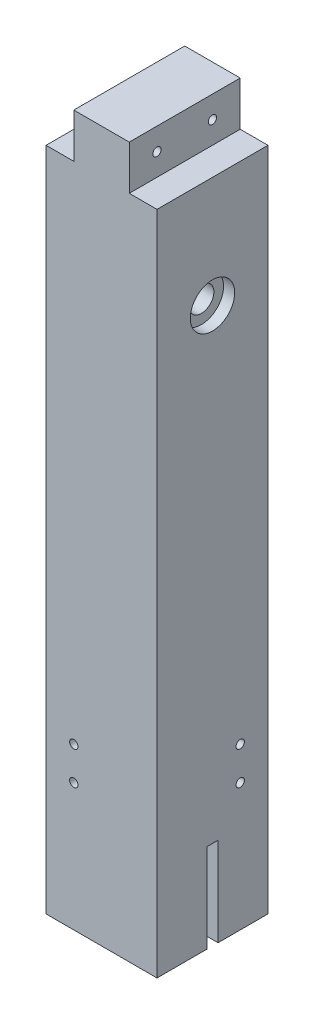
ISO-10303-21;
HEADER;
FILE_DESCRIPTION(('STEP AP214'),'2;1');
FILE_NAME('part.step','',(''),(''),'','','');
FILE_SCHEMA(('AUTOMOTIVE_DESIGN { 1 0 10303 214 1 1 1 1 }'));
ENDSEC;
DATA;
#1=APPLICATION_CONTEXT('core data for automotive mechanical design processes');
#2=APPLICATION_PROTOCOL_DEFINITION('international standard','automotive_design',2000,#1);
#3=PRODUCT_CONTEXT('',#1,'mechanical');
#4=PRODUCT('Part','Part','',(#3));
#5=PRODUCT_RELATED_PRODUCT_CATEGORY('part','',(#4));
#6=PRODUCT_DEFINITION_FORMATION('','',#4);
#7=PRODUCT_DEFINITION_CONTEXT('part definition',#1,'design');
#8=PRODUCT_DEFINITION('design','',#6,#7);
#9=PRODUCT_DEFINITION_SHAPE('','',#8);
#10=(LENGTH_UNIT() NAMED_UNIT(*) SI_UNIT(.MILLI.,.METRE.));
#11=(NAMED_UNIT(*) PLANE_ANGLE_UNIT() SI_UNIT($,.RADIAN.));
#12=(NAMED_UNIT(*) SI_UNIT($,.STERADIAN.) SOLID_ANGLE_UNIT());
#13=UNCERTAINTY_MEASURE_WITH_UNIT(LENGTH_MEASURE(1.E-05),#10,'distance_accuracy_value','');
#14=(GEOMETRIC_REPRESENTATION_CONTEXT(3) GLOBAL_UNCERTAINTY_ASSIGNED_CONTEXT((#13)) GLOBAL_UNIT_ASSIGNED_CONTEXT((#10,
#11,#12)) REPRESENTATION_CONTEXT('',''));
#15=CARTESIAN_POINT('',(0.,0.,0.));
#16=DIRECTION('',(0.,0.,1.));
#17=DIRECTION('',(1.,0.,0.));
#18=AXIS2_PLACEMENT_3D('',#15,#16,#17);
#19=CARTESIAN_POINT('',(-63.5000000000001,254.,63.5));
#20=DIRECTION('',(1.,0.,0.));
#21=DIRECTION('',(0.,1.,0.));
#22=AXIS2_PLACEMENT_3D('',#19,#20,#21);
#23=CYLINDRICAL_SURFACE('',#22,14.2875);
#24=CARTESIAN_POINT('',(-63.5000000000001,254.,63.5));
#25=DIRECTION('',(1.,0.,0.));
#26=DIRECTION('',(0.,1.,0.));
#27=AXIS2_PLACEMENT_3D('',#24,#25,#26);
#28=CIRCLE('',#27,14.2875);
#29=CARTESIAN_POINT('',(-63.5000000000001,268.2875,63.5));
#30=VERTEX_POINT('',#29);
#31=EDGE_CURVE('E272',#30,#30,#28,.T.);
#32=ORIENTED_EDGE('',*,*,#31,.F.);
#33=EDGE_LOOP('',(#32));
#34=FACE_BOUND('',#33,.T.);
#35=CARTESIAN_POINT('',(50.8000000000001,254.,63.5));
#36=DIRECTION('',(1.,0.,0.));
#37=DIRECTION('',(0.,1.,0.));
#38=AXIS2_PLACEMENT_3D('',#35,#36,#37);
#39=CIRCLE('',#38,14.2875);
#40=CARTESIAN_POINT('',(50.8000000000001,268.2875,63.5));
#41=VERTEX_POINT('',#40);
#42=EDGE_CURVE('E233',#41,#41,#39,.T.);
#43=ORIENTED_EDGE('',*,*,#42,.T.);
#44=EDGE_LOOP('',(#43));
#45=FACE_BOUND('',#44,.T.);
#46=ADVANCED_FACE('F33',(#34,#45),#23,.F.);
#47=CARTESIAN_POINT('',(-63.4999999999998,0.,127.));
#48=DIRECTION('',(1.,0.,0.));
#49=DIRECTION('',(0.,1.,0.));
#50=AXIS2_PLACEMENT_3D('',#47,#48,#49);
#51=PLANE('',#50);
#52=DIRECTION('',(0.,0.,1.));
#53=VECTOR('',#52,1.);
#54=CARTESIAN_POINT('',(-63.4999999999997,-254.,95.25));
#55=LINE('',#54,#53);
#56=CARTESIAN_POINT('',(-63.4999999999997,-254.,63.5));
#57=VERTEX_POINT('',#56);
#58=CARTESIAN_POINT('',(-63.4999999999997,-254.,95.25));
#59=VERTEX_POINT('',#58);
#60=EDGE_CURVE('E203',#57,#59,#55,.T.);
#61=ORIENTED_EDGE('',*,*,#60,.F.);
#62=DIRECTION('',(0.,-1.,0.));
#63=VECTOR('',#62,1.);
#64=CARTESIAN_POINT('',(-63.4999999999997,-177.8,63.5));
#65=LINE('',#64,#63);
#66=CARTESIAN_POINT('',(-63.4999999999997,-177.8,63.5));
#67=VERTEX_POINT('',#66);
#68=EDGE_CURVE('E50',#67,#57,#65,.T.);
#69=ORIENTED_EDGE('',*,*,#68,.F.);
#70=DIRECTION('',(0.,0.,-1.));
#71=VECTOR('',#70,1.);
#72=CARTESIAN_POINT('',(-63.4999999999997,-177.8,95.25));
#73=LINE('',#72,#71);
#74=CARTESIAN_POINT('',(-63.4999999999997,-177.8,95.25));
#75=VERTEX_POINT('',#74);
#76=EDGE_CURVE('E191',#75,#67,#73,.T.);
#77=ORIENTED_EDGE('',*,*,#76,.F.);
#78=DIRECTION('',(0.,1.,0.));
#79=VECTOR('',#78,1.);
#80=CARTESIAN_POINT('',(-63.4999999999997,-177.8,95.25));
#81=LINE('',#80,#79);
#82=EDGE_CURVE('E194',#59,#75,#81,.T.);
#83=ORIENTED_EDGE('',*,*,#82,.F.);
#84=EDGE_LOOP('',(#61,#69,#77,#83));
#85=FACE_BOUND('',#84,.T.);
#86=ORIENTED_EDGE('',*,*,#31,.T.);
#87=EDGE_LOOP('',(#86));
#88=FACE_BOUND('',#87,.T.);
#89=DIRECTION('',(0.,1.,0.));
#90=VECTOR('',#89,1.);
#91=CARTESIAN_POINT('',(-63.5000000000001,0.,69.85));
#92=LINE('',#91,#90);
#93=CARTESIAN_POINT('',(-63.5,-381.,69.85));
#94=VERTEX_POINT('',#93);
#95=CARTESIAN_POINT('',(-63.5,-279.4,69.85));
#96=VERTEX_POINT('',#95);
#97=EDGE_CURVE('E277',#94,#96,#92,.T.);
#98=ORIENTED_EDGE('',*,*,#97,.F.);
#99=DIRECTION('',(0.,0.,-1.));
#100=VECTOR('',#99,1.);
#101=CARTESIAN_POINT('',(-63.4999999999996,-381.,127.));
#102=LINE('',#101,#100);
#103=CARTESIAN_POINT('',(-63.4999999999996,-381.,127.));
#104=VERTEX_POINT('',#103);
#105=EDGE_CURVE('E353',#104,#94,#102,.T.);
#106=ORIENTED_EDGE('',*,*,#105,.F.);
#107=DIRECTION('',(0.,-1.,0.));
#108=VECTOR('',#107,1.);
#109=CARTESIAN_POINT('',(-63.4999999999998,0.,127.));
#110=LINE('',#109,#108);
#111=CARTESIAN_POINT('',(-63.5,381.,127.));
#112=VERTEX_POINT('',#111);
#113=EDGE_CURVE('E320',#112,#104,#110,.T.);
#114=ORIENTED_EDGE('',*,*,#113,.F.);
#115=DIRECTION('',(0.,0.,-1.));
#116=VECTOR('',#115,1.);
#117=CARTESIAN_POINT('',(-63.5,381.,127.));
#118=LINE('',#117,#116);
#119=CARTESIAN_POINT('',(-63.5,381.,0.));
#120=VERTEX_POINT('',#119);
#121=EDGE_CURVE('E356',#112,#120,#118,.T.);
#122=ORIENTED_EDGE('',*,*,#121,.T.);
#123=DIRECTION('',(0.,-1.,0.));
#124=VECTOR('',#123,1.);
#125=CARTESIAN_POINT('',(-63.4999999999998,0.,0.));
#126=LINE('',#125,#124);
#127=CARTESIAN_POINT('',(-63.4999999999996,-381.,0.));
#128=VERTEX_POINT('',#127);
#129=EDGE_CURVE('E339',#120,#128,#126,.T.);
#130=ORIENTED_EDGE('',*,*,#129,.T.);
#131=CARTESIAN_POINT('',(-63.5,-381.,57.15));
#132=VERTEX_POINT('',#131);
#133=EDGE_CURVE('E352',#132,#128,#102,.T.);
#134=ORIENTED_EDGE('',*,*,#133,.F.);
#135=DIRECTION('',(0.,1.,0.));
#136=VECTOR('',#135,1.);
#137=CARTESIAN_POINT('',(-63.5000000000001,0.,57.15));
#138=LINE('',#137,#136);
#139=CARTESIAN_POINT('',(-63.5,-279.4,57.15));
#140=VERTEX_POINT('',#139);
#141=EDGE_CURVE('E279',#132,#140,#138,.T.);
#142=ORIENTED_EDGE('',*,*,#141,.T.);
#143=DIRECTION('',(0.,0.,1.));
#144=VECTOR('',#143,1.);
#145=CARTESIAN_POINT('',(-63.5,-279.4,0.));
#146=LINE('',#145,#144);
#147=EDGE_CURVE('E283',#140,#96,#146,.T.);
#148=ORIENTED_EDGE('',*,*,#147,.T.);
#149=EDGE_LOOP('',(#98,#106,#114,#122,#130,#134,#142,#148));
#150=FACE_BOUND('',#149,.T.);
#151=ADVANCED_FACE('F417',(#85,#88,#150),#51,.F.);
#152=CARTESIAN_POINT('',(1.66533453693774E-13,-381.,127.));
#153=DIRECTION('',(0.,-1.,0.));
#154=DIRECTION('',(1.,0.,0.));
#155=AXIS2_PLACEMENT_3D('',#152,#153,#154);
#156=PLANE('',#155);
#157=ORIENTED_EDGE('',*,*,#105,.T.);
#158=DIRECTION('',(1.,0.,0.));
#159=VECTOR('',#158,1.);
#160=CARTESIAN_POINT('',(-63.5,-381.,69.85));
#161=LINE('',#160,#159);
#162=CARTESIAN_POINT('',(63.5000000000001,-381.,69.85));
#163=VERTEX_POINT('',#162);
#164=EDGE_CURVE('E286',#94,#163,#161,.T.);
#165=ORIENTED_EDGE('',*,*,#164,.T.);
#166=DIRECTION('',(0.,0.,-1.));
#167=VECTOR('',#166,1.);
#168=CARTESIAN_POINT('',(63.5000000000001,-381.,127.));
#169=LINE('',#168,#167);
#170=CARTESIAN_POINT('',(63.5000000000001,-381.,127.));
#171=VERTEX_POINT('',#170);
#172=EDGE_CURVE('E349',#171,#163,#169,.T.);
#173=ORIENTED_EDGE('',*,*,#172,.F.);
#174=DIRECTION('',(-1.,0.,0.));
#175=VECTOR('',#174,1.);
#176=CARTESIAN_POINT('',(1.66533453693774E-13,-381.,127.));
#177=LINE('',#176,#175);
#178=EDGE_CURVE('E322',#171,#104,#177,.T.);
#179=ORIENTED_EDGE('',*,*,#178,.T.);
#180=EDGE_LOOP('',(#157,#165,#173,#179));
#181=FACE_BOUND('',#180,.T.);
#182=ADVANCED_FACE('F423',(#181),#156,.T.);
#183=CARTESIAN_POINT('',(63.5000000000001,0.,127.));
#184=DIRECTION('',(1.,0.,0.));
#185=DIRECTION('',(0.,1.,0.));
#186=AXIS2_PLACEMENT_3D('',#183,#184,#185);
#187=PLANE('',#186);
#188=CARTESIAN_POINT('',(63.5000000000001,-196.85,31.75));
#189=DIRECTION('',(1.,0.,0.));
#190=DIRECTION('',(0.,1.,0.));
#191=AXIS2_PLACEMENT_3D('',#188,#189,#190);
#192=CIRCLE('',#191,4.7625);
#193=CARTESIAN_POINT('',(63.5000000000001,-192.0875,31.75));
#194=VERTEX_POINT('',#193);
#195=EDGE_CURVE('E209',#194,#194,#192,.T.);
#196=ORIENTED_EDGE('',*,*,#195,.F.);
#197=EDGE_LOOP('',(#196));
#198=FACE_BOUND('',#197,.T.);
#199=CARTESIAN_POINT('',(63.5000000000001,-234.95,31.75));
#200=DIRECTION('',(1.,0.,0.));
#201=DIRECTION('',(0.,1.,0.));
#202=AXIS2_PLACEMENT_3D('',#199,#200,#201);
#203=CIRCLE('',#202,4.7625);
#204=CARTESIAN_POINT('',(63.5000000000001,-230.1875,31.75));
#205=VERTEX_POINT('',#204);
#206=EDGE_CURVE('E222',#205,#205,#203,.T.);
#207=ORIENTED_EDGE('',*,*,#206,.F.);
#208=EDGE_LOOP('',(#207));
#209=FACE_BOUND('',#208,.T.);
#210=CARTESIAN_POINT('',(63.5000000000001,254.,63.5));
#211=DIRECTION('',(1.,0.,0.));
#212=DIRECTION('',(0.,1.,0.));
#213=AXIS2_PLACEMENT_3D('',#210,#211,#212);
#214=CIRCLE('',#213,25.4);
#215=CARTESIAN_POINT('',(63.5000000000001,279.4,63.5));
#216=VERTEX_POINT('',#215);
#217=EDGE_CURVE('E232',#216,#216,#214,.T.);
#218=ORIENTED_EDGE('',*,*,#217,.F.);
#219=EDGE_LOOP('',(#218));
#220=FACE_BOUND('',#219,.T.);
#221=ORIENTED_EDGE('',*,*,#172,.T.);
#222=DIRECTION('',(0.,1.,0.));
#223=VECTOR('',#222,1.);
#224=CARTESIAN_POINT('',(63.5000000000001,0.,69.85));
#225=LINE('',#224,#223);
#226=CARTESIAN_POINT('',(63.5000000000001,-279.4,69.85));
#227=VERTEX_POINT('',#226);
#228=EDGE_CURVE('E266',#163,#227,#225,.T.);
#229=ORIENTED_EDGE('',*,*,#228,.T.);
#230=DIRECTION('',(0.,0.,1.));
#231=VECTOR('',#230,1.);
#232=CARTESIAN_POINT('',(63.5000000000001,-279.4,0.));
#233=LINE('',#232,#231);
#234=CARTESIAN_POINT('',(63.5000000000001,-279.4,57.15));
#235=VERTEX_POINT('',#234);
#236=EDGE_CURVE('E280',#235,#227,#233,.T.);
#237=ORIENTED_EDGE('',*,*,#236,.F.);
#238=DIRECTION('',(0.,1.,0.));
#239=VECTOR('',#238,1.);
#240=CARTESIAN_POINT('',(63.5000000000001,0.,57.15));
#241=LINE('',#240,#239);
#242=CARTESIAN_POINT('',(63.5000000000001,-381.,57.15));
#243=VERTEX_POINT('',#242);
#244=EDGE_CURVE('E289',#243,#235,#241,.T.);
#245=ORIENTED_EDGE('',*,*,#244,.F.);
#246=CARTESIAN_POINT('',(63.5000000000001,-381.,0.));
#247=VERTEX_POINT('',#246);
#248=EDGE_CURVE('E348',#243,#247,#169,.T.);
#249=ORIENTED_EDGE('',*,*,#248,.T.);
#250=DIRECTION('',(0.,-1.,0.));
#251=VECTOR('',#250,1.);
#252=CARTESIAN_POINT('',(63.5000000000001,0.,0.));
#253=LINE('',#252,#251);
#254=CARTESIAN_POINT('',(63.5,381.,0.));
#255=VERTEX_POINT('',#254);
#256=EDGE_CURVE('E312',#255,#247,#253,.T.);
#257=ORIENTED_EDGE('',*,*,#256,.F.);
#258=DIRECTION('',(0.,0.,-1.));
#259=VECTOR('',#258,1.);
#260=CARTESIAN_POINT('',(63.5,381.,127.));
#261=LINE('',#260,#259);
#262=CARTESIAN_POINT('',(63.5,381.,127.));
#263=VERTEX_POINT('',#262);
#264=EDGE_CURVE('E328',#263,#255,#261,.T.);
#265=ORIENTED_EDGE('',*,*,#264,.F.);
#266=DIRECTION('',(0.,-1.,0.));
#267=VECTOR('',#266,1.);
#268=CARTESIAN_POINT('',(63.5000000000001,0.,127.));
#269=LINE('',#268,#267);
#270=EDGE_CURVE('E325',#263,#171,#269,.T.);
#271=ORIENTED_EDGE('',*,*,#270,.T.);
#272=EDGE_LOOP('',(#221,#229,#237,#245,#249,#257,#265,#271));
#273=FACE_BOUND('',#272,.T.);
#274=ADVANCED_FACE('F457',(#198,#209,#220,#273),#187,.T.);
#275=CARTESIAN_POINT('',(-1.66533453693773E-13,381.,127.));
#276=DIRECTION('',(0.,-1.,0.));
#277=DIRECTION('',(1.,0.,0.));
#278=AXIS2_PLACEMENT_3D('',#275,#276,#277);
#279=PLANE('',#278);
#280=DIRECTION('',(-1.,0.,0.));
#281=VECTOR('',#280,1.);
#282=CARTESIAN_POINT('',(-1.66533453693773E-13,381.,0.));
#283=LINE('',#282,#281);
#284=CARTESIAN_POINT('',(31.75,381.,0.));
#285=VERTEX_POINT('',#284);
#286=EDGE_CURVE('E308',#255,#285,#283,.T.);
#287=ORIENTED_EDGE('',*,*,#286,.T.);
#288=DIRECTION('',(0.,0.,-1.));
#289=VECTOR('',#288,1.);
#290=CARTESIAN_POINT('',(31.75,381.,127.));
#291=LINE('',#290,#289);
#292=CARTESIAN_POINT('',(31.75,381.,127.));
#293=VERTEX_POINT('',#292);
#294=EDGE_CURVE('E11',#293,#285,#291,.T.);
#295=ORIENTED_EDGE('',*,*,#294,.F.);
#296=DIRECTION('',(-1.,0.,0.));
#297=VECTOR('',#296,1.);
#298=CARTESIAN_POINT('',(-1.66533453693773E-13,381.,127.));
#299=LINE('',#298,#297);
#300=EDGE_CURVE('E309',#263,#293,#299,.T.);
#301=ORIENTED_EDGE('',*,*,#300,.F.);
#302=ORIENTED_EDGE('',*,*,#264,.T.);
#303=EDGE_LOOP('',(#287,#295,#301,#302));
#304=FACE_BOUND('',#303,.T.);
#305=ADVANCED_FACE('F460',(#304),#279,.F.);
#306=CARTESIAN_POINT('',(31.75,0.,127.));
#307=DIRECTION('',(1.,0.,0.));
#308=DIRECTION('',(0.,1.,0.));
#309=AXIS2_PLACEMENT_3D('',#306,#307,#308);
#310=PLANE('',#309);
#311=CARTESIAN_POINT('',(31.75,406.4,31.75));
#312=DIRECTION('',(1.,0.,0.));
#313=DIRECTION('',(0.,1.,0.));
#314=AXIS2_PLACEMENT_3D('',#311,#312,#313);
#315=CIRCLE('',#314,4.7625);
#316=CARTESIAN_POINT('',(31.75,411.1625,31.75));
#317=VERTEX_POINT('',#316);
#318=EDGE_CURVE('E301',#317,#317,#315,.T.);
#319=ORIENTED_EDGE('',*,*,#318,.F.);
#320=EDGE_LOOP('',(#319));
#321=FACE_BOUND('',#320,.T.);
#322=CARTESIAN_POINT('',(31.75,406.4,95.25));
#323=DIRECTION('',(1.,0.,0.));
#324=DIRECTION('',(0.,1.,0.));
#325=AXIS2_PLACEMENT_3D('',#322,#323,#324);
#326=CIRCLE('',#325,4.7625);
#327=CARTESIAN_POINT('',(31.75,411.1625,95.25));
#328=VERTEX_POINT('',#327);
#329=EDGE_CURVE('E305',#328,#328,#326,.T.);
#330=ORIENTED_EDGE('',*,*,#329,.F.);
#331=EDGE_LOOP('',(#330));
#332=FACE_BOUND('',#331,.T.);
#333=DIRECTION('',(0.,-1.,0.));
#334=VECTOR('',#333,1.);
#335=CARTESIAN_POINT('',(31.75,0.,0.));
#336=LINE('',#335,#334);
#337=CARTESIAN_POINT('',(31.75,431.8,0.));
#338=VERTEX_POINT('',#337);
#339=EDGE_CURVE('E331',#338,#285,#336,.T.);
#340=ORIENTED_EDGE('',*,*,#339,.F.);
#341=DIRECTION('',(0.,0.,-1.));
#342=VECTOR('',#341,1.);
#343=CARTESIAN_POINT('',(31.75,431.8,127.));
#344=LINE('',#343,#342);
#345=CARTESIAN_POINT('',(31.75,431.8,127.));
#346=VERTEX_POINT('',#345);
#347=EDGE_CURVE('E42',#346,#338,#344,.T.);
#348=ORIENTED_EDGE('',*,*,#347,.F.);
#349=DIRECTION('',(0.,-1.,0.));
#350=VECTOR('',#349,1.);
#351=CARTESIAN_POINT('',(31.75,0.,127.));
#352=LINE('',#351,#350);
#353=EDGE_CURVE('E311',#346,#293,#352,.T.);
#354=ORIENTED_EDGE('',*,*,#353,.T.);
#355=ORIENTED_EDGE('',*,*,#294,.T.);
#356=EDGE_LOOP('',(#340,#348,#354,#355));
#357=FACE_BOUND('',#356,.T.);
#358=ADVANCED_FACE('F35',(#321,#332,#357),#310,.T.);
#359=CARTESIAN_POINT('',(0.,431.8,127.));
#360=DIRECTION('',(0.,-1.,0.));
#361=DIRECTION('',(0.,0.,-1.));
#362=AXIS2_PLACEMENT_3D('',#359,#360,#361);
#363=PLANE('',#362);
#364=DIRECTION('',(-1.,0.,0.));
#365=VECTOR('',#364,1.);
#366=CARTESIAN_POINT('',(0.,431.8,0.));
#367=LINE('',#366,#365);
#368=CARTESIAN_POINT('',(-31.75,431.8,0.));
#369=VERTEX_POINT('',#368);
#370=EDGE_CURVE('E335',#338,#369,#367,.T.);
#371=ORIENTED_EDGE('',*,*,#370,.T.);
#372=DIRECTION('',(0.,0.,-1.));
#373=VECTOR('',#372,1.);
#374=CARTESIAN_POINT('',(-31.75,431.8,127.));
#375=LINE('',#374,#373);
#376=CARTESIAN_POINT('',(-31.75,431.8,127.));
#377=VERTEX_POINT('',#376);
#378=EDGE_CURVE('E362',#377,#369,#375,.T.);
#379=ORIENTED_EDGE('',*,*,#378,.F.);
#380=DIRECTION('',(-1.,0.,0.));
#381=VECTOR('',#380,1.);
#382=CARTESIAN_POINT('',(0.,431.8,127.));
#383=LINE('',#382,#381);
#384=EDGE_CURVE('E316',#346,#377,#383,.T.);
#385=ORIENTED_EDGE('',*,*,#384,.F.);
#386=ORIENTED_EDGE('',*,*,#347,.T.);
#387=EDGE_LOOP('',(#371,#379,#385,#386));
#388=FACE_BOUND('',#387,.T.);
#389=ADVANCED_FACE('F471',(#388),#363,.F.);
#390=CARTESIAN_POINT('',(-31.7499999999999,0.,127.));
#391=DIRECTION('',(1.,0.,0.));
#392=DIRECTION('',(0.,1.,0.));
#393=AXIS2_PLACEMENT_3D('',#390,#391,#392);
#394=PLANE('',#393);
#395=CARTESIAN_POINT('',(-31.75,406.4,31.75));
#396=DIRECTION('',(1.,0.,0.));
#397=DIRECTION('',(0.,1.,0.));
#398=AXIS2_PLACEMENT_3D('',#395,#396,#397);
#399=CIRCLE('',#398,4.7625);
#400=CARTESIAN_POINT('',(-31.75,411.1625,31.75));
#401=VERTEX_POINT('',#400);
#402=EDGE_CURVE('E275',#401,#401,#399,.T.);
#403=ORIENTED_EDGE('',*,*,#402,.T.);
#404=EDGE_LOOP('',(#403));
#405=FACE_BOUND('',#404,.T.);
#406=CARTESIAN_POINT('',(-31.75,406.4,95.25));
#407=DIRECTION('',(1.,0.,0.));
#408=DIRECTION('',(0.,1.,0.));
#409=AXIS2_PLACEMENT_3D('',#406,#407,#408);
#410=CIRCLE('',#409,4.7625);
#411=CARTESIAN_POINT('',(-31.75,411.1625,95.25));
#412=VERTEX_POINT('',#411);
#413=EDGE_CURVE('E304',#412,#412,#410,.T.);
#414=ORIENTED_EDGE('',*,*,#413,.T.);
#415=EDGE_LOOP('',(#414));
#416=FACE_BOUND('',#415,.T.);
#417=DIRECTION('',(0.,-1.,0.));
#418=VECTOR('',#417,1.);
#419=CARTESIAN_POINT('',(-31.7499999999999,0.,0.));
#420=LINE('',#419,#418);
#421=CARTESIAN_POINT('',(-31.75,381.,0.));
#422=VERTEX_POINT('',#421);
#423=EDGE_CURVE('E337',#369,#422,#420,.T.);
#424=ORIENTED_EDGE('',*,*,#423,.T.);
#425=DIRECTION('',(0.,0.,-1.));
#426=VECTOR('',#425,1.);
#427=CARTESIAN_POINT('',(-31.75,381.,127.));
#428=LINE('',#427,#426);
#429=CARTESIAN_POINT('',(-31.75,381.,127.));
#430=VERTEX_POINT('',#429);
#431=EDGE_CURVE('E359',#430,#422,#428,.T.);
#432=ORIENTED_EDGE('',*,*,#431,.F.);
#433=DIRECTION('',(0.,-1.,0.));
#434=VECTOR('',#433,1.);
#435=CARTESIAN_POINT('',(-31.7499999999999,0.,127.));
#436=LINE('',#435,#434);
#437=EDGE_CURVE('E318',#377,#430,#436,.T.);
#438=ORIENTED_EDGE('',*,*,#437,.F.);
#439=ORIENTED_EDGE('',*,*,#378,.T.);
#440=EDGE_LOOP('',(#424,#432,#438,#439));
#441=FACE_BOUND('',#440,.T.);
#442=ADVANCED_FACE('F468',(#405,#416,#441),#394,.F.);
#443=EDGE_CURVE('E332',#422,#120,#283,.T.);
#444=ORIENTED_EDGE('',*,*,#443,.T.);
#445=ORIENTED_EDGE('',*,*,#121,.F.);
#446=EDGE_CURVE('E313',#430,#112,#299,.T.);
#447=ORIENTED_EDGE('',*,*,#446,.F.);
#448=ORIENTED_EDGE('',*,*,#431,.T.);
#449=EDGE_LOOP('',(#444,#445,#447,#448));
#450=FACE_BOUND('',#449,.T.);
#451=ADVANCED_FACE('F463',(#450),#279,.F.);
#452=DIRECTION('',(1.,0.,0.));
#453=VECTOR('',#452,1.);
#454=CARTESIAN_POINT('',(-63.5,-381.,57.15));
#455=LINE('',#454,#453);
#456=EDGE_CURVE('E297',#132,#243,#455,.T.);
#457=ORIENTED_EDGE('',*,*,#456,.F.);
#458=ORIENTED_EDGE('',*,*,#133,.T.);
#459=DIRECTION('',(-1.,0.,0.));
#460=VECTOR('',#459,1.);
#461=CARTESIAN_POINT('',(1.66533453693774E-13,-381.,0.));
#462=LINE('',#461,#460);
#463=EDGE_CURVE('E342',#247,#128,#462,.T.);
#464=ORIENTED_EDGE('',*,*,#463,.F.);
#465=ORIENTED_EDGE('',*,*,#248,.F.);
#466=EDGE_LOOP('',(#457,#458,#464,#465));
#467=FACE_BOUND('',#466,.T.);
#468=ADVANCED_FACE('F452',(#467),#156,.T.);
#469=CARTESIAN_POINT('',(0.,0.,127.));
#470=DIRECTION('',(0.,0.,1.));
#471=DIRECTION('',(1.,0.,0.));
#472=AXIS2_PLACEMENT_3D('',#469,#470,#471);
#473=PLANE('',#472);
#474=CARTESIAN_POINT('',(-31.7499999999997,-196.85,127.));
#475=DIRECTION('',(0.,0.,1.));
#476=DIRECTION('',(1.,0.,0.));
#477=AXIS2_PLACEMENT_3D('',#474,#475,#476);
#478=CIRCLE('',#477,4.7625);
#479=CARTESIAN_POINT('',(-26.9874999999997,-196.85,127.));
#480=VERTEX_POINT('',#479);
#481=EDGE_CURVE('E389',#480,#480,#478,.T.);
#482=ORIENTED_EDGE('',*,*,#481,.F.);
#483=EDGE_LOOP('',(#482));
#484=FACE_BOUND('',#483,.T.);
#485=CARTESIAN_POINT('',(-31.7499999999997,-234.95,127.));
#486=DIRECTION('',(0.,0.,1.));
#487=DIRECTION('',(1.,0.,0.));
#488=AXIS2_PLACEMENT_3D('',#485,#486,#487);
#489=CIRCLE('',#488,4.7625);
#490=CARTESIAN_POINT('',(-26.9874999999997,-234.95,127.));
#491=VERTEX_POINT('',#490);
#492=EDGE_CURVE('E380',#491,#491,#489,.T.);
#493=ORIENTED_EDGE('',*,*,#492,.F.);
#494=EDGE_LOOP('',(#493));
#495=FACE_BOUND('',#494,.T.);
#496=ORIENTED_EDGE('',*,*,#300,.T.);
#497=ORIENTED_EDGE('',*,*,#353,.F.);
#498=ORIENTED_EDGE('',*,*,#384,.T.);
#499=ORIENTED_EDGE('',*,*,#437,.T.);
#500=ORIENTED_EDGE('',*,*,#446,.T.);
#501=ORIENTED_EDGE('',*,*,#113,.T.);
#502=ORIENTED_EDGE('',*,*,#178,.F.);
#503=ORIENTED_EDGE('',*,*,#270,.F.);
#504=EDGE_LOOP('',(#496,#497,#498,#499,#500,#501,#502,#503));
#505=FACE_BOUND('',#504,.T.);
#506=ADVANCED_FACE('F449',(#484,#495,#505),#473,.T.);
#507=CARTESIAN_POINT('',(0.,0.,0.));
#508=DIRECTION('',(0.,0.,1.));
#509=DIRECTION('',(1.,0.,0.));
#510=AXIS2_PLACEMENT_3D('',#507,#508,#509);
#511=PLANE('',#510);
#512=DIRECTION('',(-1.,0.,0.));
#513=VECTOR('',#512,1.);
#514=CARTESIAN_POINT('',(0.,-254.,0.));
#515=LINE('',#514,#513);
#516=CARTESIAN_POINT('',(31.75,-254.,0.));
#517=VERTEX_POINT('',#516);
#518=CARTESIAN_POINT('',(0.,-254.,0.));
#519=VERTEX_POINT('',#518);
#520=EDGE_CURVE('E256',#517,#519,#515,.T.);
#521=ORIENTED_EDGE('',*,*,#520,.F.);
#522=DIRECTION('',(0.,-1.,0.));
#523=VECTOR('',#522,1.);
#524=CARTESIAN_POINT('',(31.75,-177.8,0.));
#525=LINE('',#524,#523);
#526=CARTESIAN_POINT('',(31.75,-177.8,0.));
#527=VERTEX_POINT('',#526);
#528=EDGE_CURVE('E58',#527,#517,#525,.T.);
#529=ORIENTED_EDGE('',*,*,#528,.F.);
#530=DIRECTION('',(1.,0.,0.));
#531=VECTOR('',#530,1.);
#532=CARTESIAN_POINT('',(0.,-177.8,0.));
#533=LINE('',#532,#531);
#534=CARTESIAN_POINT('',(0.,-177.8,0.));
#535=VERTEX_POINT('',#534);
#536=EDGE_CURVE('E245',#535,#527,#533,.T.);
#537=ORIENTED_EDGE('',*,*,#536,.F.);
#538=DIRECTION('',(0.,1.,0.));
#539=VECTOR('',#538,1.);
#540=CARTESIAN_POINT('',(0.,-177.8,0.));
#541=LINE('',#540,#539);
#542=EDGE_CURVE('E259',#519,#535,#541,.T.);
#543=ORIENTED_EDGE('',*,*,#542,.F.);
#544=EDGE_LOOP('',(#521,#529,#537,#543));
#545=FACE_BOUND('',#544,.T.);
#546=ORIENTED_EDGE('',*,*,#286,.F.);
#547=ORIENTED_EDGE('',*,*,#256,.T.);
#548=ORIENTED_EDGE('',*,*,#463,.T.);
#549=ORIENTED_EDGE('',*,*,#129,.F.);
#550=ORIENTED_EDGE('',*,*,#443,.F.);
#551=ORIENTED_EDGE('',*,*,#423,.F.);
#552=ORIENTED_EDGE('',*,*,#370,.F.);
#553=ORIENTED_EDGE('',*,*,#339,.T.);
#554=EDGE_LOOP('',(#546,#547,#548,#549,#550,#551,#552,#553));
#555=FACE_BOUND('',#554,.T.);
#556=ADVANCED_FACE('F447',(#545,#555),#511,.F.);
#557=CARTESIAN_POINT('',(-63.5000000000001,406.4,95.25));
#558=DIRECTION('',(1.,0.,0.));
#559=DIRECTION('',(0.,1.,0.));
#560=AXIS2_PLACEMENT_3D('',#557,#558,#559);
#561=CYLINDRICAL_SURFACE('',#560,4.7625);
#562=ORIENTED_EDGE('',*,*,#329,.T.);
#563=EDGE_LOOP('',(#562));
#564=FACE_BOUND('',#563,.T.);
#565=ORIENTED_EDGE('',*,*,#413,.F.);
#566=EDGE_LOOP('',(#565));
#567=FACE_BOUND('',#566,.T.);
#568=ADVANCED_FACE('F443',(#564,#567),#561,.F.);
#569=CARTESIAN_POINT('',(-63.5000000000001,0.,69.85));
#570=DIRECTION('',(0.,0.,-1.));
#571=DIRECTION('',(-1.,0.,0.));
#572=AXIS2_PLACEMENT_3D('',#569,#570,#571);
#573=PLANE('',#572);
#574=ORIENTED_EDGE('',*,*,#228,.F.);
#575=ORIENTED_EDGE('',*,*,#164,.F.);
#576=ORIENTED_EDGE('',*,*,#97,.T.);
#577=DIRECTION('',(1.,0.,0.));
#578=VECTOR('',#577,1.);
#579=CARTESIAN_POINT('',(-63.5,-279.4,69.85));
#580=LINE('',#579,#578);
#581=EDGE_CURVE('E276',#96,#227,#580,.T.);
#582=ORIENTED_EDGE('',*,*,#581,.T.);
#583=EDGE_LOOP('',(#574,#575,#576,#582));
#584=FACE_BOUND('',#583,.T.);
#585=ADVANCED_FACE('F436',(#584),#573,.T.);
#586=CARTESIAN_POINT('',(-63.5,-279.4,0.));
#587=DIRECTION('',(0.,1.,0.));
#588=DIRECTION('',(-1.,0.,0.));
#589=AXIS2_PLACEMENT_3D('',#586,#587,#588);
#590=PLANE('',#589);
#591=ORIENTED_EDGE('',*,*,#236,.T.);
#592=ORIENTED_EDGE('',*,*,#581,.F.);
#593=ORIENTED_EDGE('',*,*,#147,.F.);
#594=DIRECTION('',(1.,0.,0.));
#595=VECTOR('',#594,1.);
#596=CARTESIAN_POINT('',(-63.5,-279.4,57.15));
#597=LINE('',#596,#595);
#598=EDGE_CURVE('E295',#140,#235,#597,.T.);
#599=ORIENTED_EDGE('',*,*,#598,.T.);
#600=EDGE_LOOP('',(#591,#592,#593,#599));
#601=FACE_BOUND('',#600,.T.);
#602=ADVANCED_FACE('F432',(#601),#590,.F.);
#603=CARTESIAN_POINT('',(-63.5000000000001,0.,57.15));
#604=DIRECTION('',(0.,0.,-1.));
#605=DIRECTION('',(-1.,0.,0.));
#606=AXIS2_PLACEMENT_3D('',#603,#604,#605);
#607=PLANE('',#606);
#608=ORIENTED_EDGE('',*,*,#244,.T.);
#609=ORIENTED_EDGE('',*,*,#598,.F.);
#610=ORIENTED_EDGE('',*,*,#141,.F.);
#611=ORIENTED_EDGE('',*,*,#456,.T.);
#612=EDGE_LOOP('',(#608,#609,#610,#611));
#613=FACE_BOUND('',#612,.T.);
#614=ADVANCED_FACE('F435',(#613),#607,.F.);
#615=CARTESIAN_POINT('',(-63.5000000000001,406.4,31.75));
#616=DIRECTION('',(1.,0.,0.));
#617=DIRECTION('',(0.,1.,0.));
#618=AXIS2_PLACEMENT_3D('',#615,#616,#617);
#619=CYLINDRICAL_SURFACE('',#618,4.7625);
#620=ORIENTED_EDGE('',*,*,#318,.T.);
#621=EDGE_LOOP('',(#620));
#622=FACE_BOUND('',#621,.T.);
#623=ORIENTED_EDGE('',*,*,#402,.F.);
#624=EDGE_LOOP('',(#623));
#625=FACE_BOUND('',#624,.T.);
#626=ADVANCED_FACE('F430',(#622,#625),#619,.F.);
#627=CARTESIAN_POINT('',(31.75,-177.8,63.5));
#628=DIRECTION('',(1.,0.,0.));
#629=DIRECTION('',(0.,1.,0.));
#630=AXIS2_PLACEMENT_3D('',#627,#628,#629);
#631=PLANE('',#630);
#632=CARTESIAN_POINT('',(31.75,-196.85,31.75));
#633=DIRECTION('',(1.,0.,0.));
#634=DIRECTION('',(0.,1.,0.));
#635=AXIS2_PLACEMENT_3D('',#632,#633,#634);
#636=CIRCLE('',#635,4.7625);
#637=CARTESIAN_POINT('',(31.75,-192.0875,31.75));
#638=VERTEX_POINT('',#637);
#639=EDGE_CURVE('E219',#638,#638,#636,.T.);
#640=ORIENTED_EDGE('',*,*,#639,.T.);
#641=EDGE_LOOP('',(#640));
#642=FACE_BOUND('',#641,.T.);
#643=CARTESIAN_POINT('',(31.75,-234.95,31.75));
#644=DIRECTION('',(1.,0.,0.));
#645=DIRECTION('',(0.,1.,0.));
#646=AXIS2_PLACEMENT_3D('',#643,#644,#645);
#647=CIRCLE('',#646,4.7625);
#648=CARTESIAN_POINT('',(31.75,-230.1875,31.75));
#649=VERTEX_POINT('',#648);
#650=EDGE_CURVE('E229',#649,#649,#647,.T.);
#651=ORIENTED_EDGE('',*,*,#650,.T.);
#652=EDGE_LOOP('',(#651));
#653=FACE_BOUND('',#652,.T.);
#654=ORIENTED_EDGE('',*,*,#528,.T.);
#655=DIRECTION('',(0.,0.,-1.));
#656=VECTOR('',#655,1.);
#657=CARTESIAN_POINT('',(31.75,-254.,63.5));
#658=LINE('',#657,#656);
#659=CARTESIAN_POINT('',(31.75,-254.,63.5));
#660=VERTEX_POINT('',#659);
#661=EDGE_CURVE('E254',#660,#517,#658,.T.);
#662=ORIENTED_EDGE('',*,*,#661,.F.);
#663=DIRECTION('',(0.,-1.,0.));
#664=VECTOR('',#663,1.);
#665=CARTESIAN_POINT('',(31.75,-177.8,63.5));
#666=LINE('',#665,#664);
#667=CARTESIAN_POINT('',(31.75,-177.8,63.5));
#668=VERTEX_POINT('',#667);
#669=EDGE_CURVE('E241',#668,#660,#666,.T.);
#670=ORIENTED_EDGE('',*,*,#669,.F.);
#671=DIRECTION('',(0.,0.,-1.));
#672=VECTOR('',#671,1.);
#673=CARTESIAN_POINT('',(31.75,-177.8,63.5));
#674=LINE('',#673,#672);
#675=EDGE_CURVE('E264',#668,#527,#674,.T.);
#676=ORIENTED_EDGE('',*,*,#675,.T.);
#677=EDGE_LOOP('',(#654,#662,#670,#676));
#678=FACE_BOUND('',#677,.T.);
#679=ADVANCED_FACE('F586',(#642,#653,#678),#631,.F.);
#680=CARTESIAN_POINT('',(0.,-177.8,63.5));
#681=DIRECTION('',(0.,1.,0.));
#682=DIRECTION('',(0.,0.,1.));
#683=AXIS2_PLACEMENT_3D('',#680,#681,#682);
#684=PLANE('',#683);
#685=ORIENTED_EDGE('',*,*,#536,.T.);
#686=ORIENTED_EDGE('',*,*,#675,.F.);
#687=DIRECTION('',(1.,0.,0.));
#688=VECTOR('',#687,1.);
#689=CARTESIAN_POINT('',(0.,-177.8,63.5));
#690=LINE('',#689,#688);
#691=CARTESIAN_POINT('',(0.,-177.8,63.5));
#692=VERTEX_POINT('',#691);
#693=EDGE_CURVE('E251',#692,#668,#690,.T.);
#694=ORIENTED_EDGE('',*,*,#693,.F.);
#695=DIRECTION('',(0.,0.,-1.));
#696=VECTOR('',#695,1.);
#697=CARTESIAN_POINT('',(0.,-177.8,63.5));
#698=LINE('',#697,#696);
#699=EDGE_CURVE('E267',#692,#535,#698,.T.);
#700=ORIENTED_EDGE('',*,*,#699,.T.);
#701=EDGE_LOOP('',(#685,#686,#694,#700));
#702=FACE_BOUND('',#701,.T.);
#703=ADVANCED_FACE('F600',(#702),#684,.F.);
#704=CARTESIAN_POINT('',(0.,-177.8,63.5));
#705=DIRECTION('',(-1.,0.,0.));
#706=DIRECTION('',(0.,-1.,0.));
#707=AXIS2_PLACEMENT_3D('',#704,#705,#706);
#708=PLANE('',#707);
#709=CARTESIAN_POINT('',(0.,-196.85,31.75));
#710=DIRECTION('',(-1.,0.,0.));
#711=DIRECTION('',(0.,-1.,0.));
#712=AXIS2_PLACEMENT_3D('',#709,#710,#711);
#713=CIRCLE('',#712,4.7625);
#714=CARTESIAN_POINT('',(0.,-201.6125,31.75));
#715=VERTEX_POINT('',#714);
#716=EDGE_CURVE('E216',#715,#715,#713,.T.);
#717=ORIENTED_EDGE('',*,*,#716,.T.);
#718=EDGE_LOOP('',(#717));
#719=FACE_BOUND('',#718,.T.);
#720=CARTESIAN_POINT('',(0.,-234.95,31.75));
#721=DIRECTION('',(-1.,0.,0.));
#722=DIRECTION('',(0.,-1.,0.));
#723=AXIS2_PLACEMENT_3D('',#720,#721,#722);
#724=CIRCLE('',#723,4.7625);
#725=CARTESIAN_POINT('',(0.,-239.7125,31.75));
#726=VERTEX_POINT('',#725);
#727=EDGE_CURVE('E226',#726,#726,#724,.T.);
#728=ORIENTED_EDGE('',*,*,#727,.T.);
#729=EDGE_LOOP('',(#728));
#730=FACE_BOUND('',#729,.T.);
#731=ORIENTED_EDGE('',*,*,#542,.T.);
#732=ORIENTED_EDGE('',*,*,#699,.F.);
#733=DIRECTION('',(0.,1.,0.));
#734=VECTOR('',#733,1.);
#735=CARTESIAN_POINT('',(0.,-177.8,63.5));
#736=LINE('',#735,#734);
#737=CARTESIAN_POINT('',(0.,-254.,63.5));
#738=VERTEX_POINT('',#737);
#739=EDGE_CURVE('E248',#738,#692,#736,.T.);
#740=ORIENTED_EDGE('',*,*,#739,.F.);
#741=DIRECTION('',(0.,0.,-1.));
#742=VECTOR('',#741,1.);
#743=CARTESIAN_POINT('',(0.,-254.,63.5));
#744=LINE('',#743,#742);
#745=EDGE_CURVE('E269',#738,#519,#744,.T.);
#746=ORIENTED_EDGE('',*,*,#745,.T.);
#747=EDGE_LOOP('',(#731,#732,#740,#746));
#748=FACE_BOUND('',#747,.T.);
#749=ADVANCED_FACE('F605',(#719,#730,#748),#708,.F.);
#750=CARTESIAN_POINT('',(0.,-254.,63.5));
#751=DIRECTION('',(0.,-1.,0.));
#752=DIRECTION('',(1.,0.,0.));
#753=AXIS2_PLACEMENT_3D('',#750,#751,#752);
#754=PLANE('',#753);
#755=ORIENTED_EDGE('',*,*,#520,.T.);
#756=ORIENTED_EDGE('',*,*,#745,.F.);
#757=DIRECTION('',(-1.,0.,0.));
#758=VECTOR('',#757,1.);
#759=CARTESIAN_POINT('',(0.,-254.,63.5));
#760=LINE('',#759,#758);
#761=EDGE_CURVE('E244',#660,#738,#760,.T.);
#762=ORIENTED_EDGE('',*,*,#761,.F.);
#763=ORIENTED_EDGE('',*,*,#661,.T.);
#764=EDGE_LOOP('',(#755,#756,#762,#763));
#765=FACE_BOUND('',#764,.T.);
#766=ADVANCED_FACE('F613',(#765),#754,.F.);
#767=CARTESIAN_POINT('',(0.,0.,63.5));
#768=DIRECTION('',(0.,0.,1.));
#769=DIRECTION('',(1.,0.,0.));
#770=AXIS2_PLACEMENT_3D('',#767,#768,#769);
#771=PLANE('',#770);
#772=ORIENTED_EDGE('',*,*,#669,.T.);
#773=ORIENTED_EDGE('',*,*,#761,.T.);
#774=ORIENTED_EDGE('',*,*,#739,.T.);
#775=ORIENTED_EDGE('',*,*,#693,.T.);
#776=EDGE_LOOP('',(#772,#773,#774,#775));
#777=FACE_BOUND('',#776,.T.);
#778=ADVANCED_FACE('F618',(#777),#771,.F.);
#779=CARTESIAN_POINT('',(50.8000000000001,254.,63.5));
#780=DIRECTION('',(1.,0.,0.));
#781=DIRECTION('',(0.,1.,0.));
#782=AXIS2_PLACEMENT_3D('',#779,#780,#781);
#783=CYLINDRICAL_SURFACE('',#782,25.4);
#784=CARTESIAN_POINT('',(50.8000000000001,254.,63.5));
#785=DIRECTION('',(1.,0.,0.));
#786=DIRECTION('',(0.,1.,0.));
#787=AXIS2_PLACEMENT_3D('',#784,#785,#786);
#788=CIRCLE('',#787,25.4);
#789=CARTESIAN_POINT('',(50.8000000000001,279.4,63.5));
#790=VERTEX_POINT('',#789);
#791=EDGE_CURVE('E236',#790,#790,#788,.T.);
#792=ORIENTED_EDGE('',*,*,#791,.F.);
#793=EDGE_LOOP('',(#792));
#794=FACE_BOUND('',#793,.T.);
#795=ORIENTED_EDGE('',*,*,#217,.T.);
#796=EDGE_LOOP('',(#795));
#797=FACE_BOUND('',#796,.T.);
#798=ADVANCED_FACE('F627',(#794,#797),#783,.F.);
#799=CARTESIAN_POINT('',(50.8000000000001,0.,0.));
#800=DIRECTION('',(1.,0.,0.));
#801=DIRECTION('',(0.,1.,0.));
#802=AXIS2_PLACEMENT_3D('',#799,#800,#801);
#803=PLANE('',#802);
#804=ORIENTED_EDGE('',*,*,#42,.F.);
#805=EDGE_LOOP('',(#804));
#806=FACE_BOUND('',#805,.T.);
#807=ORIENTED_EDGE('',*,*,#791,.T.);
#808=EDGE_LOOP('',(#807));
#809=FACE_BOUND('',#808,.T.);
#810=ADVANCED_FACE('F641',(#806,#809),#803,.T.);
#811=CARTESIAN_POINT('',(-6.34999999999993,0.,0.));
#812=DIRECTION('',(1.,0.,0.));
#813=DIRECTION('',(0.,1.,0.));
#814=AXIS2_PLACEMENT_3D('',#811,#812,#813);
#815=PLANE('',#814);
#816=CARTESIAN_POINT('',(-6.34999999999991,-234.95,31.75));
#817=DIRECTION('',(1.,0.,0.));
#818=DIRECTION('',(0.,1.,0.));
#819=AXIS2_PLACEMENT_3D('',#816,#817,#818);
#820=CIRCLE('',#819,4.7625);
#821=CARTESIAN_POINT('',(-6.34999999999991,-230.1875,31.75));
#822=VERTEX_POINT('',#821);
#823=EDGE_CURVE('E223',#822,#822,#820,.T.);
#824=ORIENTED_EDGE('',*,*,#823,.T.);
#825=EDGE_LOOP('',(#824));
#826=FACE_BOUND('',#825,.T.);
#827=ADVANCED_FACE('F650',(#826),#815,.T.);
#828=CARTESIAN_POINT('',(-6.34999999999991,-234.95,31.75));
#829=DIRECTION('',(1.,0.,0.));
#830=DIRECTION('',(0.,1.,0.));
#831=AXIS2_PLACEMENT_3D('',#828,#829,#830);
#832=CYLINDRICAL_SURFACE('',#831,4.7625);
#833=ORIENTED_EDGE('',*,*,#823,.F.);
#834=EDGE_LOOP('',(#833));
#835=FACE_BOUND('',#834,.T.);
#836=ORIENTED_EDGE('',*,*,#727,.F.);
#837=EDGE_LOOP('',(#836));
#838=FACE_BOUND('',#837,.T.);
#839=ADVANCED_FACE('F661',(#835,#838),#832,.F.);
#840=ORIENTED_EDGE('',*,*,#206,.T.);
#841=EDGE_LOOP('',(#840));
#842=FACE_BOUND('',#841,.T.);
#843=ORIENTED_EDGE('',*,*,#650,.F.);
#844=EDGE_LOOP('',(#843));
#845=FACE_BOUND('',#844,.T.);
#846=ADVANCED_FACE('F670',(#842,#845),#832,.F.);
#847=CARTESIAN_POINT('',(-6.34999999999993,0.,0.));
#848=DIRECTION('',(1.,0.,0.));
#849=DIRECTION('',(0.,1.,0.));
#850=AXIS2_PLACEMENT_3D('',#847,#848,#849);
#851=PLANE('',#850);
#852=CARTESIAN_POINT('',(-6.34999999999991,-196.85,31.75));
#853=DIRECTION('',(1.,0.,0.));
#854=DIRECTION('',(0.,1.,0.));
#855=AXIS2_PLACEMENT_3D('',#852,#853,#854);
#856=CIRCLE('',#855,4.7625);
#857=CARTESIAN_POINT('',(-6.34999999999991,-192.0875,31.75));
#858=VERTEX_POINT('',#857);
#859=EDGE_CURVE('E213',#858,#858,#856,.T.);
#860=ORIENTED_EDGE('',*,*,#859,.T.);
#861=EDGE_LOOP('',(#860));
#862=FACE_BOUND('',#861,.T.);
#863=ADVANCED_FACE('F678',(#862),#851,.T.);
#864=CARTESIAN_POINT('',(-6.34999999999991,-196.85,31.75));
#865=DIRECTION('',(1.,0.,0.));
#866=DIRECTION('',(0.,1.,0.));
#867=AXIS2_PLACEMENT_3D('',#864,#865,#866);
#868=CYLINDRICAL_SURFACE('',#867,4.7625);
#869=ORIENTED_EDGE('',*,*,#859,.F.);
#870=EDGE_LOOP('',(#869));
#871=FACE_BOUND('',#870,.T.);
#872=ORIENTED_EDGE('',*,*,#716,.F.);
#873=EDGE_LOOP('',(#872));
#874=FACE_BOUND('',#873,.T.);
#875=ADVANCED_FACE('F685',(#871,#874),#868,.F.);
#876=ORIENTED_EDGE('',*,*,#195,.T.);
#877=EDGE_LOOP('',(#876));
#878=FACE_BOUND('',#877,.T.);
#879=ORIENTED_EDGE('',*,*,#639,.F.);
#880=EDGE_LOOP('',(#879));
#881=FACE_BOUND('',#880,.T.);
#882=ADVANCED_FACE('F693',(#878,#881),#868,.F.);
#883=CARTESIAN_POINT('',(-0.253999999999727,-177.8,63.5));
#884=DIRECTION('',(0.,0.,-1.));
#885=DIRECTION('',(0.,1.,0.));
#886=AXIS2_PLACEMENT_3D('',#883,#884,#885);
#887=PLANE('',#886);
#888=CARTESIAN_POINT('',(-31.7499999999997,-196.85,63.5));
#889=DIRECTION('',(0.,0.,-1.));
#890=DIRECTION('',(0.,1.,0.));
#891=AXIS2_PLACEMENT_3D('',#888,#889,#890);
#892=CIRCLE('',#891,4.7625);
#893=CARTESIAN_POINT('',(-31.7499999999997,-192.0875,63.5));
#894=VERTEX_POINT('',#893);
#895=EDGE_CURVE('E385',#894,#894,#892,.T.);
#896=ORIENTED_EDGE('',*,*,#895,.T.);
#897=EDGE_LOOP('',(#896));
#898=FACE_BOUND('',#897,.T.);
#899=CARTESIAN_POINT('',(-31.7499999999997,-234.95,63.5));
#900=DIRECTION('',(0.,0.,-1.));
#901=DIRECTION('',(0.,1.,0.));
#902=AXIS2_PLACEMENT_3D('',#899,#900,#901);
#903=CIRCLE('',#902,4.7625);
#904=CARTESIAN_POINT('',(-31.7499999999997,-230.1875,63.5));
#905=VERTEX_POINT('',#904);
#906=EDGE_CURVE('E197',#905,#905,#903,.T.);
#907=ORIENTED_EDGE('',*,*,#906,.T.);
#908=EDGE_LOOP('',(#907));
#909=FACE_BOUND('',#908,.T.);
#910=ORIENTED_EDGE('',*,*,#68,.T.);
#911=DIRECTION('',(-1.,0.,0.));
#912=VECTOR('',#911,1.);
#913=CARTESIAN_POINT('',(-0.253999999999685,-254.,63.5));
#914=LINE('',#913,#912);
#915=CARTESIAN_POINT('',(-0.253999999999685,-254.,63.5));
#916=VERTEX_POINT('',#915);
#917=EDGE_CURVE('E169',#916,#57,#914,.T.);
#918=ORIENTED_EDGE('',*,*,#917,.F.);
#919=DIRECTION('',(0.,-1.,0.));
#920=VECTOR('',#919,1.);
#921=CARTESIAN_POINT('',(-0.253999999999727,-177.8,63.5));
#922=LINE('',#921,#920);
#923=CARTESIAN_POINT('',(-0.253999999999727,-177.8,63.5));
#924=VERTEX_POINT('',#923);
#925=EDGE_CURVE('E173',#924,#916,#922,.T.);
#926=ORIENTED_EDGE('',*,*,#925,.F.);
#927=DIRECTION('',(-1.,0.,0.));
#928=VECTOR('',#927,1.);
#929=CARTESIAN_POINT('',(-0.253999999999727,-177.8,63.5));
#930=LINE('',#929,#928);
#931=EDGE_CURVE('E207',#924,#67,#930,.T.);
#932=ORIENTED_EDGE('',*,*,#931,.T.);
#933=EDGE_LOOP('',(#910,#918,#926,#932));
#934=FACE_BOUND('',#933,.T.);
#935=ADVANCED_FACE('F171',(#898,#909,#934),#887,.F.);
#936=CARTESIAN_POINT('',(-0.253999999999727,-177.8,95.25));
#937=DIRECTION('',(0.,1.,0.));
#938=DIRECTION('',(-1.,0.,0.));
#939=AXIS2_PLACEMENT_3D('',#936,#937,#938);
#940=PLANE('',#939);
#941=ORIENTED_EDGE('',*,*,#76,.T.);
#942=ORIENTED_EDGE('',*,*,#931,.F.);
#943=DIRECTION('',(0.,0.,-1.));
#944=VECTOR('',#943,1.);
#945=CARTESIAN_POINT('',(-0.253999999999727,-177.8,95.25));
#946=LINE('',#945,#944);
#947=CARTESIAN_POINT('',(-0.253999999999727,-177.8,95.25));
#948=VERTEX_POINT('',#947);
#949=EDGE_CURVE('E179',#948,#924,#946,.T.);
#950=ORIENTED_EDGE('',*,*,#949,.F.);
#951=DIRECTION('',(-1.,0.,0.));
#952=VECTOR('',#951,1.);
#953=CARTESIAN_POINT('',(-0.253999999999727,-177.8,95.25));
#954=LINE('',#953,#952);
#955=EDGE_CURVE('E210',#948,#75,#954,.T.);
#956=ORIENTED_EDGE('',*,*,#955,.T.);
#957=EDGE_LOOP('',(#941,#942,#950,#956));
#958=FACE_BOUND('',#957,.T.);
#959=ADVANCED_FACE('F707',(#958),#940,.F.);
#960=CARTESIAN_POINT('',(-0.253999999999727,-177.8,95.25));
#961=DIRECTION('',(0.,0.,1.));
#962=DIRECTION('',(0.,-1.,0.));
#963=AXIS2_PLACEMENT_3D('',#960,#961,#962);
#964=PLANE('',#963);
#965=CARTESIAN_POINT('',(-31.7499999999997,-196.85,95.25));
#966=DIRECTION('',(0.,0.,1.));
#967=DIRECTION('',(0.,-1.,0.));
#968=AXIS2_PLACEMENT_3D('',#965,#966,#967);
#969=CIRCLE('',#968,4.7625);
#970=CARTESIAN_POINT('',(-31.7499999999997,-201.6125,95.25));
#971=VERTEX_POINT('',#970);
#972=EDGE_CURVE('E37',#971,#971,#969,.T.);
#973=ORIENTED_EDGE('',*,*,#972,.T.);
#974=EDGE_LOOP('',(#973));
#975=FACE_BOUND('',#974,.T.);
#976=CARTESIAN_POINT('',(-31.7499999999997,-234.95,95.25));
#977=DIRECTION('',(0.,0.,1.));
#978=DIRECTION('',(0.,-1.,0.));
#979=AXIS2_PLACEMENT_3D('',#976,#977,#978);
#980=CIRCLE('',#979,4.7625);
#981=CARTESIAN_POINT('',(-31.7499999999997,-239.7125,95.25));
#982=VERTEX_POINT('',#981);
#983=EDGE_CURVE('E373',#982,#982,#980,.T.);
#984=ORIENTED_EDGE('',*,*,#983,.T.);
#985=EDGE_LOOP('',(#984));
#986=FACE_BOUND('',#985,.T.);
#987=ORIENTED_EDGE('',*,*,#82,.T.);
#988=ORIENTED_EDGE('',*,*,#955,.F.);
#989=DIRECTION('',(0.,1.,0.));
#990=VECTOR('',#989,1.);
#991=CARTESIAN_POINT('',(-0.253999999999727,-177.8,95.25));
#992=LINE('',#991,#990);
#993=CARTESIAN_POINT('',(-0.253999999999685,-254.,95.25));
#994=VERTEX_POINT('',#993);
#995=EDGE_CURVE('E187',#994,#948,#992,.T.);
#996=ORIENTED_EDGE('',*,*,#995,.F.);
#997=DIRECTION('',(-1.,0.,0.));
#998=VECTOR('',#997,1.);
#999=CARTESIAN_POINT('',(-0.253999999999685,-254.,95.25));
#1000=LINE('',#999,#998);
#1001=EDGE_CURVE('E178',#994,#59,#1000,.T.);
#1002=ORIENTED_EDGE('',*,*,#1001,.T.);
#1003=EDGE_LOOP('',(#987,#988,#996,#1002));
#1004=FACE_BOUND('',#1003,.T.);
#1005=ADVANCED_FACE('F399',(#975,#986,#1004),#964,.F.);
#1006=CARTESIAN_POINT('',(-0.253999999999685,-254.,95.25));
#1007=DIRECTION('',(0.,-1.,0.));
#1008=DIRECTION('',(1.,0.,0.));
#1009=AXIS2_PLACEMENT_3D('',#1006,#1007,#1008);
#1010=PLANE('',#1009);
#1011=ORIENTED_EDGE('',*,*,#60,.T.);
#1012=ORIENTED_EDGE('',*,*,#1001,.F.);
#1013=DIRECTION('',(0.,0.,1.));
#1014=VECTOR('',#1013,1.);
#1015=CARTESIAN_POINT('',(-0.253999999999685,-254.,95.25));
#1016=LINE('',#1015,#1014);
#1017=EDGE_CURVE('E182',#916,#994,#1016,.T.);
#1018=ORIENTED_EDGE('',*,*,#1017,.F.);
#1019=ORIENTED_EDGE('',*,*,#917,.T.);
#1020=EDGE_LOOP('',(#1011,#1012,#1018,#1019));
#1021=FACE_BOUND('',#1020,.T.);
#1022=ADVANCED_FACE('F183',(#1021),#1010,.F.);
#1023=CARTESIAN_POINT('',(-0.253999999999824,0.,0.));
#1024=DIRECTION('',(1.,0.,0.));
#1025=DIRECTION('',(0.,1.,0.));
#1026=AXIS2_PLACEMENT_3D('',#1023,#1024,#1025);
#1027=PLANE('',#1026);
#1028=ORIENTED_EDGE('',*,*,#925,.T.);
#1029=ORIENTED_EDGE('',*,*,#1017,.T.);
#1030=ORIENTED_EDGE('',*,*,#995,.T.);
#1031=ORIENTED_EDGE('',*,*,#949,.T.);
#1032=EDGE_LOOP('',(#1028,#1029,#1030,#1031));
#1033=FACE_BOUND('',#1032,.T.);
#1034=ADVANCED_FACE('F189',(#1033),#1027,.F.);
#1035=CARTESIAN_POINT('',(-31.7499999999997,-234.95,57.15));
#1036=DIRECTION('',(0.,0.,1.));
#1037=DIRECTION('',(1.,0.,0.));
#1038=AXIS2_PLACEMENT_3D('',#1035,#1036,#1037);
#1039=CYLINDRICAL_SURFACE('',#1038,4.7625);
#1040=ORIENTED_EDGE('',*,*,#492,.T.);
#1041=EDGE_LOOP('',(#1040));
#1042=FACE_BOUND('',#1041,.T.);
#1043=ORIENTED_EDGE('',*,*,#983,.F.);
#1044=EDGE_LOOP('',(#1043));
#1045=FACE_BOUND('',#1044,.T.);
#1046=ADVANCED_FACE('F736',(#1042,#1045),#1039,.F.);
#1047=CARTESIAN_POINT('',(-31.7499999999997,-234.95,57.15));
#1048=DIRECTION('',(0.,0.,1.));
#1049=DIRECTION('',(1.,0.,0.));
#1050=AXIS2_PLACEMENT_3D('',#1047,#1048,#1049);
#1051=CIRCLE('',#1050,4.7625);
#1052=CARTESIAN_POINT('',(-26.9874999999997,-234.95,57.15));
#1053=VERTEX_POINT('',#1052);
#1054=EDGE_CURVE('E375',#1053,#1053,#1051,.T.);
#1055=ORIENTED_EDGE('',*,*,#1054,.F.);
#1056=EDGE_LOOP('',(#1055));
#1057=FACE_BOUND('',#1056,.T.);
#1058=ORIENTED_EDGE('',*,*,#906,.F.);
#1059=EDGE_LOOP('',(#1058));
#1060=FACE_BOUND('',#1059,.T.);
#1061=ADVANCED_FACE('F413',(#1057,#1060),#1039,.F.);
#1062=CARTESIAN_POINT('',(0.,0.,57.15));
#1063=DIRECTION('',(0.,0.,1.));
#1064=DIRECTION('',(1.,0.,0.));
#1065=AXIS2_PLACEMENT_3D('',#1062,#1063,#1064);
#1066=PLANE('',#1065);
#1067=ORIENTED_EDGE('',*,*,#1054,.T.);
#1068=EDGE_LOOP('',(#1067));
#1069=FACE_BOUND('',#1068,.T.);
#1070=ADVANCED_FACE('F404',(#1069),#1066,.T.);
#1071=CARTESIAN_POINT('',(-31.7499999999997,-196.85,57.15));
#1072=DIRECTION('',(0.,0.,1.));
#1073=DIRECTION('',(1.,0.,0.));
#1074=AXIS2_PLACEMENT_3D('',#1071,#1072,#1073);
#1075=CYLINDRICAL_SURFACE('',#1074,4.7625);
#1076=ORIENTED_EDGE('',*,*,#481,.T.);
#1077=EDGE_LOOP('',(#1076));
#1078=FACE_BOUND('',#1077,.T.);
#1079=ORIENTED_EDGE('',*,*,#972,.F.);
#1080=EDGE_LOOP('',(#1079));
#1081=FACE_BOUND('',#1080,.T.);
#1082=ADVANCED_FACE('F401',(#1078,#1081),#1075,.F.);
#1083=CARTESIAN_POINT('',(-31.7499999999997,-196.85,57.15));
#1084=DIRECTION('',(0.,0.,1.));
#1085=DIRECTION('',(1.,0.,0.));
#1086=AXIS2_PLACEMENT_3D('',#1083,#1084,#1085);
#1087=CIRCLE('',#1086,4.7625);
#1088=CARTESIAN_POINT('',(-26.9874999999997,-196.85,57.15));
#1089=VERTEX_POINT('',#1088);
#1090=EDGE_CURVE('E392',#1089,#1089,#1087,.T.);
#1091=ORIENTED_EDGE('',*,*,#1090,.F.);
#1092=EDGE_LOOP('',(#1091));
#1093=FACE_BOUND('',#1092,.T.);
#1094=ORIENTED_EDGE('',*,*,#895,.F.);
#1095=EDGE_LOOP('',(#1094));
#1096=FACE_BOUND('',#1095,.T.);
#1097=ADVANCED_FACE('F403',(#1093,#1096),#1075,.F.);
#1098=CARTESIAN_POINT('',(0.,0.,57.15));
#1099=DIRECTION('',(0.,0.,1.));
#1100=DIRECTION('',(1.,0.,0.));
#1101=AXIS2_PLACEMENT_3D('',#1098,#1099,#1100);
#1102=PLANE('',#1101);
#1103=ORIENTED_EDGE('',*,*,#1090,.T.);
#1104=EDGE_LOOP('',(#1103));
#1105=FACE_BOUND('',#1104,.T.);
#1106=ADVANCED_FACE('F411',(#1105),#1102,.T.);
#1107=CLOSED_SHELL('',(#46,#151,#182,#274,#305,#358,#389,#442,#451,#468,#506,#556,#568,#585,
#602,#614,#626,#679,#703,#749,#766,#778,#798,#810,#827,#839,#846,#863,#875,#882,#935,#959,#1005,
#1022,#1034,#1046,#1061,#1070,#1082,#1097,#1106));
#1108=MANIFOLD_SOLID_BREP('B2',#1107);
#1109=ADVANCED_BREP_SHAPE_REPRESENTATION('',(#18,#1108),#14);
#1110=SHAPE_DEFINITION_REPRESENTATION(#9,#1109);
ENDSEC;
END-ISO-10303-21;
